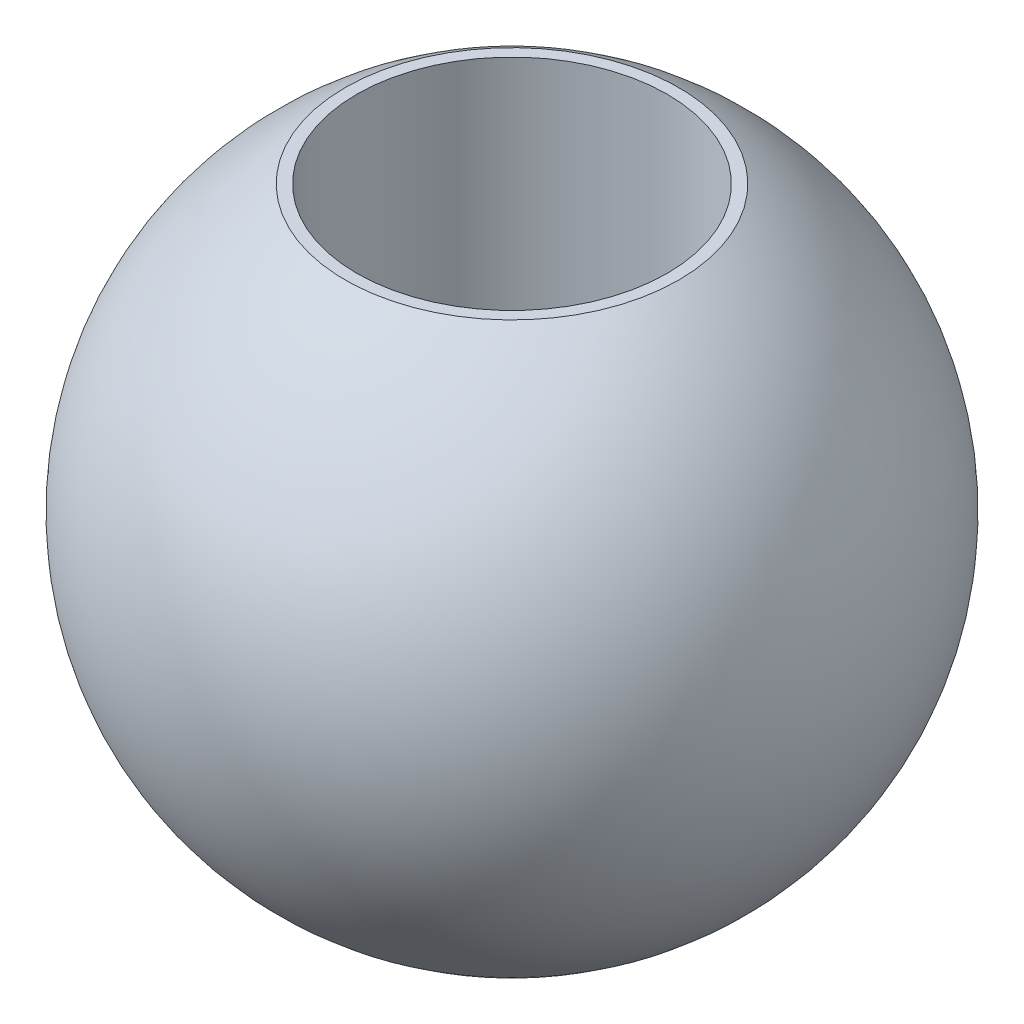
ISO-10303-21;
HEADER;
FILE_DESCRIPTION(('STEP AP214'),'2;1');
FILE_NAME('part.step','',(''),(''),'','','');
FILE_SCHEMA(('AUTOMOTIVE_DESIGN { 1 0 10303 214 1 1 1 1 }'));
ENDSEC;
DATA;
#1=APPLICATION_CONTEXT('core data for automotive mechanical design processes');
#2=APPLICATION_PROTOCOL_DEFINITION('international standard','automotive_design',2000,#1);
#3=PRODUCT_CONTEXT('',#1,'mechanical');
#4=PRODUCT('Part','Part','',(#3));
#5=PRODUCT_RELATED_PRODUCT_CATEGORY('part','',(#4));
#6=PRODUCT_DEFINITION_FORMATION('','',#4);
#7=PRODUCT_DEFINITION_CONTEXT('part definition',#1,'design');
#8=PRODUCT_DEFINITION('design','',#6,#7);
#9=PRODUCT_DEFINITION_SHAPE('','',#8);
#10=(LENGTH_UNIT() NAMED_UNIT(*) SI_UNIT(.MILLI.,.METRE.));
#11=(NAMED_UNIT(*) PLANE_ANGLE_UNIT() SI_UNIT($,.RADIAN.));
#12=(NAMED_UNIT(*) SI_UNIT($,.STERADIAN.) SOLID_ANGLE_UNIT());
#13=UNCERTAINTY_MEASURE_WITH_UNIT(LENGTH_MEASURE(1.E-05),#10,'distance_accuracy_value','');
#14=(GEOMETRIC_REPRESENTATION_CONTEXT(3) GLOBAL_UNCERTAINTY_ASSIGNED_CONTEXT((#13)) GLOBAL_UNIT_ASSIGNED_CONTEXT((#10,
#11,#12)) REPRESENTATION_CONTEXT('',''));
#15=CARTESIAN_POINT('',(0.,0.,0.));
#16=DIRECTION('',(0.,0.,1.));
#17=DIRECTION('',(1.,0.,0.));
#18=AXIS2_PLACEMENT_3D('',#15,#16,#17);
#19=CARTESIAN_POINT('',(0.,0.,0.));
#20=DIRECTION('',(-1.,0.,0.));
#21=DIRECTION('',(0.,1.,0.));
#22=AXIS2_PLACEMENT_3D('',#19,#20,#21);
#23=SPHERICAL_SURFACE('',#22,0.0778449827407712);
#24=CARTESIAN_POINT('',(-0.0778449827407712,0.,0.));
#25=VERTEX_POINT('',#24);
#26=VERTEX_LOOP('',#25);
#27=FACE_BOUND('',#26,.T.);
#28=ADVANCED_FACE('F37',(#27),#23,.T.);
#29=CLOSED_SHELL('',(#28));
#30=CARTESIAN_POINT('',(0.,0.,0.));
#31=DIRECTION('',(-1.,0.,0.));
#32=DIRECTION('',(0.,-1.,0.));
#33=AXIS2_PLACEMENT_3D('',#30,#31,#32);
#34=SPHERICAL_SURFACE('',#33,0.05);
#35=CARTESIAN_POINT('',(-0.05,0.,0.));
#36=VERTEX_POINT('',#35);
#37=VERTEX_LOOP('',#36);
#38=FACE_BOUND('',#37,.T.);
#39=ADVANCED_FACE('F50',(#38),#34,.F.);
#40=CLOSED_SHELL('',(#39));
#41=ORIENTED_CLOSED_SHELL('',*,#40,.T.);
#42=BREP_WITH_VOIDS('B2',#29,(#41));
#43=CARTESIAN_POINT('',(0.,0.,0.));
#44=DIRECTION('',(-0.477601103601981,0.878576795640637,0.));
#45=DIRECTION('',(0.878576795640637,0.477601103601981,0.));
#46=AXIS2_PLACEMENT_3D('',#43,#44,#45);
#47=SPHERICAL_SURFACE('',#46,6.79542450238309);
#48=CARTESIAN_POINT('',(0.,0.,0.));
#49=DIRECTION('',(0.,1.,0.));
#50=DIRECTION('',(0.,0.,1.));
#51=AXIS2_PLACEMENT_3D('',#48,#49,#50);
#52=SPHERICAL_SURFACE('',#51,6.79542450238309);
#53=CARTESIAN_POINT('',(0.,5.86138595713979,0.));
#54=DIRECTION('',(0.,1.,0.));
#55=DIRECTION('',(0.,0.,1.));
#56=AXIS2_PLACEMENT_3D('',#53,#54,#55);
#57=CIRCLE('',#56,3.4383060987982);
#58=CARTESIAN_POINT('',(3.43830609879821,5.86138595713979,0.));
#59=VERTEX_POINT('',#58);
#60=EDGE_CURVE('E35',#59,#59,#57,.T.);
#61=CARTESIAN_POINT('',(0.,-5.85998845503464,0.));
#62=DIRECTION('',(0.,-1.,0.));
#63=DIRECTION('',(0.,0.,-1.));
#64=AXIS2_PLACEMENT_3D('',#61,#62,#63);
#65=CIRCLE('',#64,3.44068735494075);
#66=CARTESIAN_POINT('',(3.44068735494075,-5.85998845503464,0.));
#67=VERTEX_POINT('',#66);
#68=EDGE_CURVE('E63',#67,#67,#65,.T.);
#69=CARTESIAN_POINT('',(3.43830609879821,5.86138595713979,0.));
#70=CARTESIAN_POINT('',(3.56531695602205,5.78688941998383,0.));
#71=CARTESIAN_POINT('',(3.68989837861234,5.70825296600867,0.));
#72=CARTESIAN_POINT('',(3.93369398066167,5.54305878907006,0.));
#73=CARTESIAN_POINT('',(4.05290816012072,5.4565010661066,0.));
#74=CARTESIAN_POINT('',(4.28546090204341,5.27582291584149,0.));
#75=CARTESIAN_POINT('',(4.39879946450706,5.18170248853983,0.));
#76=CARTESIAN_POINT('',(4.61912349326769,4.98629840632604,0.));
#77=CARTESIAN_POINT('',(4.72610895956466,4.8850147514139,0.));
#78=CARTESIAN_POINT('',(4.933274525677,4.67571154711564,0.));
#79=CARTESIAN_POINT('',(5.03345462549236,4.56769199772951,0.));
#80=CARTESIAN_POINT('',(5.22658637161413,4.34537343499608,0.));
#81=CARTESIAN_POINT('',(5.31953801792053,4.23107442164878,0.));
#82=CARTESIAN_POINT('',(5.49782018744626,3.99667971463517,0.));
#83=CARTESIAN_POINT('',(5.58315071066559,3.87658402096885,0.));
#84=CARTESIAN_POINT('',(5.74583018878248,3.63110326942189,0.));
#85=CARTESIAN_POINT('',(5.82317914368004,3.50571821154123,0.));
#86=CARTESIAN_POINT('',(5.969568747143,3.25018837853552,0.));
#87=CARTESIAN_POINT('',(6.0386093957084,3.12004360341047,0.));
#88=CARTESIAN_POINT('',(6.16809074656176,2.85554409212673,0.));
#89=CARTESIAN_POINT('',(6.22853144884971,2.72118935596805,0.));
#90=CARTESIAN_POINT('',(6.34055759435808,2.44883746158984,0.));
#91=CARTESIAN_POINT('',(6.39214303757849,2.31084030337031,0.));
#92=CARTESIAN_POINT('',(6.48624075856901,2.0317864903433,0.));
#93=CARTESIAN_POINT('',(6.52875303633912,1.89072983553582,0.));
#94=CARTESIAN_POINT('',(6.6045248467256,1.60615287861931,0.));
#95=CARTESIAN_POINT('',(6.63778437934199,1.46263257651027,0.));
#96=CARTESIAN_POINT('',(6.69491020502957,1.17373458119426,0.));
#97=CARTESIAN_POINT('',(6.71877649810078,1.02835688798729,0.));
#98=CARTESIAN_POINT('',(6.75701502907801,0.736358212636668,0.));
#99=CARTESIAN_POINT('',(6.77138726698403,0.589737230493022,0.));
#100=CARTESIAN_POINT('',(6.79057697665006,0.29587133131309,0.));
#101=CARTESIAN_POINT('',(6.79539444841005,0.148626414276805,0.));
#102=CARTESIAN_POINT('',(6.79545427589561,-0.145865365028728,0.));
#103=CARTESIAN_POINT('',(6.79069663162118,-0.293112227297976,0.));
#104=CARTESIAN_POINT('',(6.77162632420396,-0.586985899192735,0.));
#105=CARTESIAN_POINT('',(6.75731366106117,-0.733612708818247,0.));
#106=CARTESIAN_POINT('',(6.71919377523332,-1.02562689676514,0.));
#107=CARTESIAN_POINT('',(6.69538655254826,-1.17101427508653,0.));
#108=CARTESIAN_POINT('',(6.63837811373165,-1.45993545735219,0.));
#109=CARTESIAN_POINT('',(6.60517689760011,-1.60346926129648,0.));
#110=CARTESIAN_POINT('',(6.52952071994245,-1.88807698157009,0.));
#111=CARTESIAN_POINT('',(6.48706575841632,-2.02915089789941,0.));
#112=CARTESIAN_POINT('',(6.3930814275585,-2.30824292074086,0.));
#113=CARTESIAN_POINT('',(6.34155205822682,-2.44626102725298,0.));
#114=CARTESIAN_POINT('',(6.22963658127422,-2.7186584164977,0.));
#115=CARTESIAN_POINT('',(6.1692504736533,-2.85303769923028,0.));
#116=CARTESIAN_POINT('',(6.03987660229445,-3.11758979825384,0.));
#117=CARTESIAN_POINT('',(5.97088883855653,-3.24776261454481,0.));
#118=CARTESIAN_POINT('',(5.82460307151342,-3.5033519060235,0.));
#119=CARTESIAN_POINT('',(5.74730506820824,-3.62876838121122,0.));
#120=CARTESIAN_POINT('',(5.58472534481316,-3.87431521080026,0.));
#121=CARTESIAN_POINT('',(5.49944362472327,-3.99444556520157,0.));
#122=CARTESIAN_POINT('',(5.32125670683607,-4.22891269070249,0.));
#123=CARTESIAN_POINT('',(5.22835150903878,-4.34324946180209,0.));
#124=CARTESIAN_POINT('',(5.03531010912265,-4.56564647755167,0.));
#125=CARTESIAN_POINT('',(4.93517390700381,-4.67370672220165,0.));
#126=CARTESIAN_POINT('',(4.72809339998473,-4.88309408267235,0.));
#127=CARTESIAN_POINT('',(4.62114909508448,-4.98442119849306,0.));
#128=CARTESIAN_POINT('',(4.40090447915043,-5.17991478444203,0.));
#129=CARTESIAN_POINT('',(4.28760416811663,-5.2740812545703,0.));
#130=CARTESIAN_POINT('',(4.05512485673594,-5.45485387843505,0.));
#131=CARTESIAN_POINT('',(3.93594585638905,-5.54146003217154,0.));
#132=CARTESIAN_POINT('',(3.69221739451595,-5.70675325207483,0.));
#133=CARTESIAN_POINT('',(3.56766793298974,-5.78544031824163,0.));
#134=CARTESIAN_POINT('',(3.44068735494075,-5.85998845503464,0.));
#135=B_SPLINE_CURVE_WITH_KNOTS('',3,(#69,#70,#71,#72,#73,#74,#75,#76,#77,#78,#79,#80,#81,#82,
#83,#84,#85,#86,#87,#88,#89,#90,#91,#92,#93,#94,#95,#96,#97,#98,#99,#100,#101,#102,#103,#104,
#105,#106,#107,#108,#109,#110,#111,#112,#113,#114,#115,#116,#117,#118,#119,#120,#121,#122,#123,
#124,#125,#126,#127,#128,#129,#130,#131,#132,#133,#134),.UNSPECIFIED.,.F.,.F.,(4,2,2,2,2,2,2,2,
2,2,2,2,2,2,2,2,2,2,2,2,2,2,2,2,2,2,2,2,2,2,2,2,4),(0.,0.441659949410623,0.883319898821245,
1.32497984823187,1.76663979764249,2.20829974705311,2.64995969646374,3.09161964587436,
3.53327959528498,3.97493954469561,4.41659949410623,4.85825944351685,5.29991939292747,
5.7415793423381,6.18323929174872,6.62489924115934,7.06655919056997,7.50821913998059,
7.94987908939121,8.39153903880183,8.83319898821246,9.27485893762308,9.7165188870337,
10.1581788364443,10.599838785855,11.0414987352656,11.4831586846762,11.9248186340868,
12.3664785834974,12.8081385329081,13.2497984823187,13.6914584317293,14.1331183811399),.UNSPECIFIED.);
#136=EDGE_CURVE('BSEAM60',#59,#67,#135,.T.);
#137=ORIENTED_EDGE('',*,*,#60,.F.);
#138=ORIENTED_EDGE('',*,*,#68,.F.);
#139=ORIENTED_EDGE('',*,*,#136,.T.);
#140=ORIENTED_EDGE('',*,*,#136,.F.);
#141=EDGE_LOOP('',(#137,#139,#138,#140));
#142=FACE_BOUND('',#141,.T.);
#143=ADVANCED_FACE('F60',(#142),#52,.T.);
#144=CARTESIAN_POINT('',(8.1599686854299,5.86138595713979,10.));
#145=DIRECTION('',(0.,1.,0.));
#146=DIRECTION('',(0.,0.,1.));
#147=AXIS2_PLACEMENT_3D('',#144,#145,#146);
#148=PLANE('',#147);
#149=CARTESIAN_POINT('',(0.,5.86138595713979,0.));
#150=DIRECTION('',(0.,1.,0.));
#151=DIRECTION('',(0.,0.,1.));
#152=AXIS2_PLACEMENT_3D('',#149,#150,#151);
#153=CIRCLE('',#152,3.2);
#154=CARTESIAN_POINT('',(0.,5.86138595713979,3.2));
#155=VERTEX_POINT('',#154);
#156=EDGE_CURVE('E74',#155,#155,#153,.T.);
#157=ORIENTED_EDGE('',*,*,#156,.F.);
#158=EDGE_LOOP('',(#157));
#159=FACE_BOUND('',#158,.T.);
#160=ORIENTED_EDGE('',*,*,#60,.T.);
#161=EDGE_LOOP('',(#160));
#162=FACE_BOUND('',#161,.T.);
#163=ADVANCED_FACE('F81',(#159,#162),#148,.T.);
#164=CARTESIAN_POINT('',(8.1599686854299,-5.85998845503464,10.));
#165=DIRECTION('',(0.,-1.,0.));
#166=DIRECTION('',(0.,0.,-1.));
#167=AXIS2_PLACEMENT_3D('',#164,#165,#166);
#168=PLANE('',#167);
#169=CARTESIAN_POINT('',(0.,-5.85998845503464,0.));
#170=DIRECTION('',(0.,-1.,0.));
#171=DIRECTION('',(0.,0.,-1.));
#172=AXIS2_PLACEMENT_3D('',#169,#170,#171);
#173=CIRCLE('',#172,3.2);
#174=CARTESIAN_POINT('',(0.,-5.85998845503464,-3.2));
#175=VERTEX_POINT('',#174);
#176=EDGE_CURVE('E70',#175,#175,#173,.F.);
#177=ORIENTED_EDGE('',*,*,#176,.T.);
#178=EDGE_LOOP('',(#177));
#179=FACE_BOUND('',#178,.T.);
#180=ORIENTED_EDGE('',*,*,#68,.T.);
#181=EDGE_LOOP('',(#180));
#182=FACE_BOUND('',#181,.T.);
#183=ADVANCED_FACE('F83',(#179,#182),#168,.T.);
#184=CARTESIAN_POINT('',(0.,-14.9109552542224,0.));
#185=DIRECTION('',(0.,1.,0.));
#186=DIRECTION('',(0.,0.,1.));
#187=AXIS2_PLACEMENT_3D('',#184,#185,#186);
#188=CYLINDRICAL_SURFACE('',#187,3.2);
#189=ORIENTED_EDGE('',*,*,#156,.T.);
#190=EDGE_LOOP('',(#189));
#191=FACE_BOUND('',#190,.T.);
#192=ORIENTED_EDGE('',*,*,#176,.F.);
#193=EDGE_LOOP('',(#192));
#194=FACE_BOUND('',#193,.T.);
#195=ADVANCED_FACE('F78',(#191,#194),#188,.F.);
#196=CLOSED_SHELL('',(#143,#163,#183,#195));
#197=MANIFOLD_SOLID_BREP('B6',#196);
#198=ADVANCED_BREP_SHAPE_REPRESENTATION('',(#18,#42,#197),#14);
#199=SHAPE_DEFINITION_REPRESENTATION(#9,#198);
ENDSEC;
END-ISO-10303-21;
